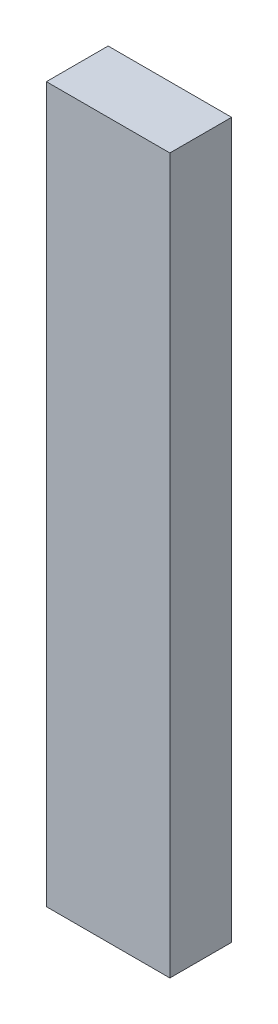
ISO-10303-21;
HEADER;
FILE_DESCRIPTION(('STEP AP214'),'2;1');
FILE_NAME('part.step','',(''),(''),'','','');
FILE_SCHEMA(('AUTOMOTIVE_DESIGN { 1 0 10303 214 1 1 1 1 }'));
ENDSEC;
DATA;
#1=APPLICATION_CONTEXT('core data for automotive mechanical design processes');
#2=APPLICATION_PROTOCOL_DEFINITION('international standard','automotive_design',2000,#1);
#3=PRODUCT_CONTEXT('',#1,'mechanical');
#4=PRODUCT('Part','Part','',(#3));
#5=PRODUCT_RELATED_PRODUCT_CATEGORY('part','',(#4));
#6=PRODUCT_DEFINITION_FORMATION('','',#4);
#7=PRODUCT_DEFINITION_CONTEXT('part definition',#1,'design');
#8=PRODUCT_DEFINITION('design','',#6,#7);
#9=PRODUCT_DEFINITION_SHAPE('','',#8);
#10=(LENGTH_UNIT() NAMED_UNIT(*) SI_UNIT(.MILLI.,.METRE.));
#11=(NAMED_UNIT(*) PLANE_ANGLE_UNIT() SI_UNIT($,.RADIAN.));
#12=(NAMED_UNIT(*) SI_UNIT($,.STERADIAN.) SOLID_ANGLE_UNIT());
#13=UNCERTAINTY_MEASURE_WITH_UNIT(LENGTH_MEASURE(1.E-05),#10,'distance_accuracy_value','');
#14=(GEOMETRIC_REPRESENTATION_CONTEXT(3) GLOBAL_UNCERTAINTY_ASSIGNED_CONTEXT((#13)) GLOBAL_UNIT_ASSIGNED_CONTEXT((#10,
#11,#12)) REPRESENTATION_CONTEXT('',''));
#15=CARTESIAN_POINT('',(0.,0.,0.));
#16=DIRECTION('',(0.,0.,1.));
#17=DIRECTION('',(1.,0.,0.));
#18=AXIS2_PLACEMENT_3D('',#15,#16,#17);
#19=CARTESIAN_POINT('',(0.,257.175,0.));
#20=DIRECTION('',(1.,0.,0.));
#21=DIRECTION('',(0.,0.,-1.));
#22=AXIS2_PLACEMENT_3D('',#19,#20,#21);
#23=PLANE('',#22);
#24=DIRECTION('',(0.,0.,1.));
#25=VECTOR('',#24,1.);
#26=CARTESIAN_POINT('',(0.,0.,0.));
#27=LINE('',#26,#25);
#28=CARTESIAN_POINT('',(0.,0.,-22.225));
#29=VERTEX_POINT('',#28);
#30=CARTESIAN_POINT('',(0.,0.,0.));
#31=VERTEX_POINT('',#30);
#32=EDGE_CURVE('E96',#29,#31,#27,.T.);
#33=ORIENTED_EDGE('',*,*,#32,.T.);
#34=DIRECTION('',(0.,-1.,0.));
#35=VECTOR('',#34,1.);
#36=CARTESIAN_POINT('',(0.,257.175,0.));
#37=LINE('',#36,#35);
#38=CARTESIAN_POINT('',(0.,257.175,0.));
#39=VERTEX_POINT('',#38);
#40=EDGE_CURVE('E11',#39,#31,#37,.T.);
#41=ORIENTED_EDGE('',*,*,#40,.F.);
#42=DIRECTION('',(0.,0.,1.));
#43=VECTOR('',#42,1.);
#44=CARTESIAN_POINT('',(0.,257.175,0.));
#45=LINE('',#44,#43);
#46=CARTESIAN_POINT('',(0.,257.175,-22.225));
#47=VERTEX_POINT('',#46);
#48=EDGE_CURVE('E84',#47,#39,#45,.T.);
#49=ORIENTED_EDGE('',*,*,#48,.F.);
#50=DIRECTION('',(0.,-1.,0.));
#51=VECTOR('',#50,1.);
#52=CARTESIAN_POINT('',(0.,257.175,-22.225));
#53=LINE('',#52,#51);
#54=EDGE_CURVE('E92',#47,#29,#53,.T.);
#55=ORIENTED_EDGE('',*,*,#54,.T.);
#56=EDGE_LOOP('',(#33,#41,#49,#55));
#57=FACE_BOUND('',#56,.T.);
#58=ADVANCED_FACE('F33',(#57),#23,.F.);
#59=CARTESIAN_POINT('',(0.,257.175,0.));
#60=DIRECTION('',(0.,0.,-1.));
#61=DIRECTION('',(-1.,0.,0.));
#62=AXIS2_PLACEMENT_3D('',#59,#60,#61);
#63=PLANE('',#62);
#64=DIRECTION('',(1.,0.,0.));
#65=VECTOR('',#64,1.);
#66=CARTESIAN_POINT('',(0.,0.,0.));
#67=LINE('',#66,#65);
#68=CARTESIAN_POINT('',(44.45,0.,0.));
#69=VERTEX_POINT('',#68);
#70=EDGE_CURVE('E88',#31,#69,#67,.T.);
#71=ORIENTED_EDGE('',*,*,#70,.T.);
#72=DIRECTION('',(0.,-1.,0.));
#73=VECTOR('',#72,1.);
#74=CARTESIAN_POINT('',(44.45,257.175,0.));
#75=LINE('',#74,#73);
#76=CARTESIAN_POINT('',(44.45,257.175,0.));
#77=VERTEX_POINT('',#76);
#78=EDGE_CURVE('E41',#77,#69,#75,.T.);
#79=ORIENTED_EDGE('',*,*,#78,.F.);
#80=DIRECTION('',(1.,0.,0.));
#81=VECTOR('',#80,1.);
#82=CARTESIAN_POINT('',(0.,257.175,0.));
#83=LINE('',#82,#81);
#84=EDGE_CURVE('E79',#39,#77,#83,.T.);
#85=ORIENTED_EDGE('',*,*,#84,.F.);
#86=ORIENTED_EDGE('',*,*,#40,.T.);
#87=EDGE_LOOP('',(#71,#79,#85,#86));
#88=FACE_BOUND('',#87,.T.);
#89=ADVANCED_FACE('F87',(#88),#63,.F.);
#90=CARTESIAN_POINT('',(44.45,257.175,0.));
#91=DIRECTION('',(-1.,0.,0.));
#92=DIRECTION('',(0.,0.,1.));
#93=AXIS2_PLACEMENT_3D('',#90,#91,#92);
#94=PLANE('',#93);
#95=DIRECTION('',(0.,0.,-1.));
#96=VECTOR('',#95,1.);
#97=CARTESIAN_POINT('',(44.45,0.,0.));
#98=LINE('',#97,#96);
#99=CARTESIAN_POINT('',(44.45,0.,-22.225));
#100=VERTEX_POINT('',#99);
#101=EDGE_CURVE('E66',#69,#100,#98,.T.);
#102=ORIENTED_EDGE('',*,*,#101,.T.);
#103=DIRECTION('',(0.,-1.,0.));
#104=VECTOR('',#103,1.);
#105=CARTESIAN_POINT('',(44.45,257.175,-22.225));
#106=LINE('',#105,#104);
#107=CARTESIAN_POINT('',(44.45,257.175,-22.225));
#108=VERTEX_POINT('',#107);
#109=EDGE_CURVE('E89',#108,#100,#106,.T.);
#110=ORIENTED_EDGE('',*,*,#109,.F.);
#111=DIRECTION('',(0.,0.,-1.));
#112=VECTOR('',#111,1.);
#113=CARTESIAN_POINT('',(44.45,257.175,0.));
#114=LINE('',#113,#112);
#115=EDGE_CURVE('E82',#77,#108,#114,.T.);
#116=ORIENTED_EDGE('',*,*,#115,.F.);
#117=ORIENTED_EDGE('',*,*,#78,.T.);
#118=EDGE_LOOP('',(#102,#110,#116,#117));
#119=FACE_BOUND('',#118,.T.);
#120=ADVANCED_FACE('F90',(#119),#94,.F.);
#121=CARTESIAN_POINT('',(0.,257.175,-22.225));
#122=DIRECTION('',(0.,0.,1.));
#123=DIRECTION('',(1.,0.,0.));
#124=AXIS2_PLACEMENT_3D('',#121,#122,#123);
#125=PLANE('',#124);
#126=DIRECTION('',(-1.,0.,0.));
#127=VECTOR('',#126,1.);
#128=CARTESIAN_POINT('',(0.,0.,-22.225));
#129=LINE('',#128,#127);
#130=EDGE_CURVE('E72',#100,#29,#129,.T.);
#131=ORIENTED_EDGE('',*,*,#130,.T.);
#132=ORIENTED_EDGE('',*,*,#54,.F.);
#133=DIRECTION('',(-1.,0.,0.));
#134=VECTOR('',#133,1.);
#135=CARTESIAN_POINT('',(0.,257.175,-22.225));
#136=LINE('',#135,#134);
#137=EDGE_CURVE('E49',#108,#47,#136,.T.);
#138=ORIENTED_EDGE('',*,*,#137,.F.);
#139=ORIENTED_EDGE('',*,*,#109,.T.);
#140=EDGE_LOOP('',(#131,#132,#138,#139));
#141=FACE_BOUND('',#140,.T.);
#142=ADVANCED_FACE('F103',(#141),#125,.F.);
#143=CARTESIAN_POINT('',(0.,257.175,0.));
#144=DIRECTION('',(0.,-1.,0.));
#145=DIRECTION('',(0.,0.,-1.));
#146=AXIS2_PLACEMENT_3D('',#143,#144,#145);
#147=PLANE('',#146);
#148=ORIENTED_EDGE('',*,*,#48,.T.);
#149=ORIENTED_EDGE('',*,*,#84,.T.);
#150=ORIENTED_EDGE('',*,*,#115,.T.);
#151=ORIENTED_EDGE('',*,*,#137,.T.);
#152=EDGE_LOOP('',(#148,#149,#150,#151));
#153=FACE_BOUND('',#152,.T.);
#154=ADVANCED_FACE('F80',(#153),#147,.F.);
#155=CARTESIAN_POINT('',(0.,0.,0.));
#156=DIRECTION('',(0.,-1.,0.));
#157=DIRECTION('',(0.,0.,-1.));
#158=AXIS2_PLACEMENT_3D('',#155,#156,#157);
#159=PLANE('',#158);
#160=ORIENTED_EDGE('',*,*,#32,.F.);
#161=ORIENTED_EDGE('',*,*,#130,.F.);
#162=ORIENTED_EDGE('',*,*,#101,.F.);
#163=ORIENTED_EDGE('',*,*,#70,.F.);
#164=EDGE_LOOP('',(#160,#161,#162,#163));
#165=FACE_BOUND('',#164,.T.);
#166=ADVANCED_FACE('F106',(#165),#159,.T.);
#167=CLOSED_SHELL('',(#58,#89,#120,#142,#154,#166));
#168=MANIFOLD_SOLID_BREP('B2',#167);
#169=ADVANCED_BREP_SHAPE_REPRESENTATION('',(#18,#168),#14);
#170=SHAPE_DEFINITION_REPRESENTATION(#9,#169);
ENDSEC;
END-ISO-10303-21;
